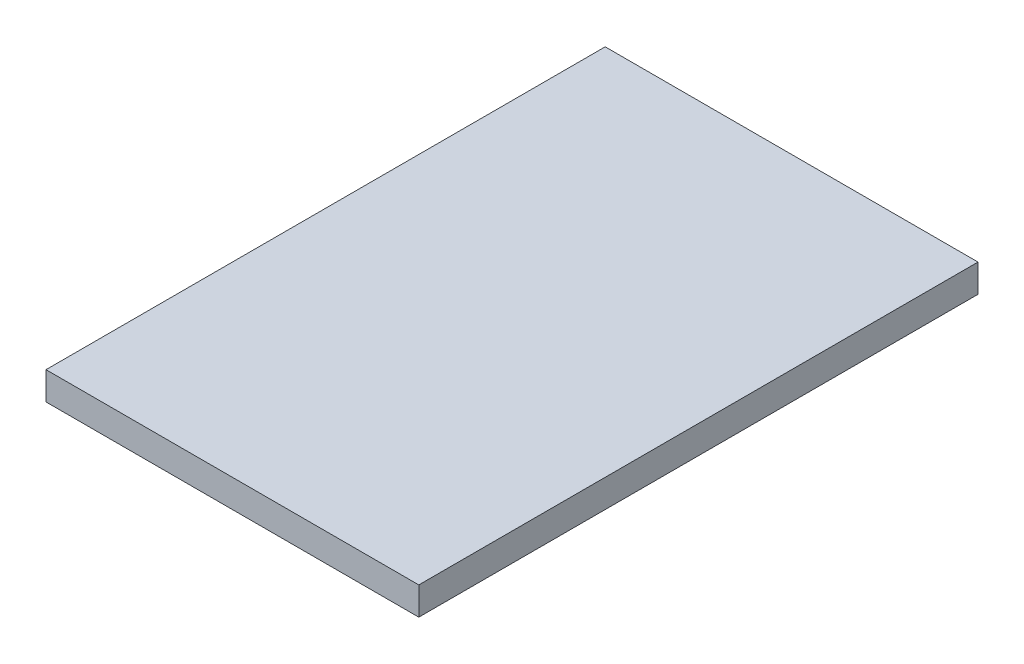
ISO-10303-21;
HEADER;
FILE_DESCRIPTION(('STEP AP214'),'2;1');
FILE_NAME('part.step','',(''),(''),'','','');
FILE_SCHEMA(('AUTOMOTIVE_DESIGN { 1 0 10303 214 1 1 1 1 }'));
ENDSEC;
DATA;
#1=APPLICATION_CONTEXT('core data for automotive mechanical design processes');
#2=APPLICATION_PROTOCOL_DEFINITION('international standard','automotive_design',2000,#1);
#3=PRODUCT_CONTEXT('',#1,'mechanical');
#4=PRODUCT('Part','Part','',(#3));
#5=PRODUCT_RELATED_PRODUCT_CATEGORY('part','',(#4));
#6=PRODUCT_DEFINITION_FORMATION('','',#4);
#7=PRODUCT_DEFINITION_CONTEXT('part definition',#1,'design');
#8=PRODUCT_DEFINITION('design','',#6,#7);
#9=PRODUCT_DEFINITION_SHAPE('','',#8);
#10=(LENGTH_UNIT() NAMED_UNIT(*) SI_UNIT(.MILLI.,.METRE.));
#11=(NAMED_UNIT(*) PLANE_ANGLE_UNIT() SI_UNIT($,.RADIAN.));
#12=(NAMED_UNIT(*) SI_UNIT($,.STERADIAN.) SOLID_ANGLE_UNIT());
#13=UNCERTAINTY_MEASURE_WITH_UNIT(LENGTH_MEASURE(1.E-05),#10,'distance_accuracy_value','');
#14=(GEOMETRIC_REPRESENTATION_CONTEXT(3) GLOBAL_UNCERTAINTY_ASSIGNED_CONTEXT((#13)) GLOBAL_UNIT_ASSIGNED_CONTEXT((#10,
#11,#12)) REPRESENTATION_CONTEXT('',''));
#15=CARTESIAN_POINT('',(0.,0.,0.));
#16=DIRECTION('',(0.,0.,1.));
#17=DIRECTION('',(1.,0.,0.));
#18=AXIS2_PLACEMENT_3D('',#15,#16,#17);
#19=CARTESIAN_POINT('',(0.,19.05,0.));
#20=DIRECTION('',(1.,0.,0.));
#21=DIRECTION('',(0.,0.,-1.));
#22=AXIS2_PLACEMENT_3D('',#19,#20,#21);
#23=PLANE('',#22);
#24=DIRECTION('',(0.,0.,1.));
#25=VECTOR('',#24,1.);
#26=CARTESIAN_POINT('',(0.,0.,0.));
#27=LINE('',#26,#25);
#28=CARTESIAN_POINT('',(0.,0.,-381.));
#29=VERTEX_POINT('',#28);
#30=CARTESIAN_POINT('',(0.,0.,0.));
#31=VERTEX_POINT('',#30);
#32=EDGE_CURVE('E97',#29,#31,#27,.T.);
#33=ORIENTED_EDGE('',*,*,#32,.T.);
#34=DIRECTION('',(0.,-1.,0.));
#35=VECTOR('',#34,1.);
#36=CARTESIAN_POINT('',(0.,19.05,0.));
#37=LINE('',#36,#35);
#38=CARTESIAN_POINT('',(0.,19.05,0.));
#39=VERTEX_POINT('',#38);
#40=EDGE_CURVE('E11',#39,#31,#37,.T.);
#41=ORIENTED_EDGE('',*,*,#40,.F.);
#42=DIRECTION('',(0.,0.,1.));
#43=VECTOR('',#42,1.);
#44=CARTESIAN_POINT('',(0.,19.05,0.));
#45=LINE('',#44,#43);
#46=CARTESIAN_POINT('',(0.,19.05,-381.));
#47=VERTEX_POINT('',#46);
#48=EDGE_CURVE('E85',#47,#39,#45,.T.);
#49=ORIENTED_EDGE('',*,*,#48,.F.);
#50=DIRECTION('',(0.,-1.,0.));
#51=VECTOR('',#50,1.);
#52=CARTESIAN_POINT('',(0.,19.05,-381.));
#53=LINE('',#52,#51);
#54=EDGE_CURVE('E93',#47,#29,#53,.T.);
#55=ORIENTED_EDGE('',*,*,#54,.T.);
#56=EDGE_LOOP('',(#33,#41,#49,#55));
#57=FACE_BOUND('',#56,.T.);
#58=ADVANCED_FACE('F34',(#57),#23,.F.);
#59=CARTESIAN_POINT('',(0.,19.05,0.));
#60=DIRECTION('',(0.,0.,-1.));
#61=DIRECTION('',(-1.,0.,0.));
#62=AXIS2_PLACEMENT_3D('',#59,#60,#61);
#63=PLANE('',#62);
#64=DIRECTION('',(1.,0.,0.));
#65=VECTOR('',#64,1.);
#66=CARTESIAN_POINT('',(0.,0.,0.));
#67=LINE('',#66,#65);
#68=CARTESIAN_POINT('',(254.,0.,0.));
#69=VERTEX_POINT('',#68);
#70=EDGE_CURVE('E89',#31,#69,#67,.T.);
#71=ORIENTED_EDGE('',*,*,#70,.T.);
#72=DIRECTION('',(0.,-1.,0.));
#73=VECTOR('',#72,1.);
#74=CARTESIAN_POINT('',(254.,19.05,0.));
#75=LINE('',#74,#73);
#76=CARTESIAN_POINT('',(254.,19.05,0.));
#77=VERTEX_POINT('',#76);
#78=EDGE_CURVE('E42',#77,#69,#75,.T.);
#79=ORIENTED_EDGE('',*,*,#78,.F.);
#80=DIRECTION('',(1.,0.,0.));
#81=VECTOR('',#80,1.);
#82=CARTESIAN_POINT('',(0.,19.05,0.));
#83=LINE('',#82,#81);
#84=EDGE_CURVE('E80',#39,#77,#83,.T.);
#85=ORIENTED_EDGE('',*,*,#84,.F.);
#86=ORIENTED_EDGE('',*,*,#40,.T.);
#87=EDGE_LOOP('',(#71,#79,#85,#86));
#88=FACE_BOUND('',#87,.T.);
#89=ADVANCED_FACE('F88',(#88),#63,.F.);
#90=CARTESIAN_POINT('',(254.,19.05,0.));
#91=DIRECTION('',(-1.,0.,0.));
#92=DIRECTION('',(0.,0.,1.));
#93=AXIS2_PLACEMENT_3D('',#90,#91,#92);
#94=PLANE('',#93);
#95=DIRECTION('',(0.,0.,-1.));
#96=VECTOR('',#95,1.);
#97=CARTESIAN_POINT('',(254.,0.,0.));
#98=LINE('',#97,#96);
#99=CARTESIAN_POINT('',(254.,0.,-381.));
#100=VERTEX_POINT('',#99);
#101=EDGE_CURVE('E67',#69,#100,#98,.T.);
#102=ORIENTED_EDGE('',*,*,#101,.T.);
#103=DIRECTION('',(0.,-1.,0.));
#104=VECTOR('',#103,1.);
#105=CARTESIAN_POINT('',(254.,19.05,-381.));
#106=LINE('',#105,#104);
#107=CARTESIAN_POINT('',(254.,19.05,-381.));
#108=VERTEX_POINT('',#107);
#109=EDGE_CURVE('E90',#108,#100,#106,.T.);
#110=ORIENTED_EDGE('',*,*,#109,.F.);
#111=DIRECTION('',(0.,0.,-1.));
#112=VECTOR('',#111,1.);
#113=CARTESIAN_POINT('',(254.,19.05,0.));
#114=LINE('',#113,#112);
#115=EDGE_CURVE('E83',#77,#108,#114,.T.);
#116=ORIENTED_EDGE('',*,*,#115,.F.);
#117=ORIENTED_EDGE('',*,*,#78,.T.);
#118=EDGE_LOOP('',(#102,#110,#116,#117));
#119=FACE_BOUND('',#118,.T.);
#120=ADVANCED_FACE('F91',(#119),#94,.F.);
#121=CARTESIAN_POINT('',(0.,19.05,-381.));
#122=DIRECTION('',(0.,0.,1.));
#123=DIRECTION('',(1.,0.,0.));
#124=AXIS2_PLACEMENT_3D('',#121,#122,#123);
#125=PLANE('',#124);
#126=DIRECTION('',(-1.,0.,0.));
#127=VECTOR('',#126,1.);
#128=CARTESIAN_POINT('',(0.,0.,-381.));
#129=LINE('',#128,#127);
#130=EDGE_CURVE('E73',#100,#29,#129,.T.);
#131=ORIENTED_EDGE('',*,*,#130,.T.);
#132=ORIENTED_EDGE('',*,*,#54,.F.);
#133=DIRECTION('',(-1.,0.,0.));
#134=VECTOR('',#133,1.);
#135=CARTESIAN_POINT('',(0.,19.05,-381.));
#136=LINE('',#135,#134);
#137=EDGE_CURVE('E50',#108,#47,#136,.T.);
#138=ORIENTED_EDGE('',*,*,#137,.F.);
#139=ORIENTED_EDGE('',*,*,#109,.T.);
#140=EDGE_LOOP('',(#131,#132,#138,#139));
#141=FACE_BOUND('',#140,.T.);
#142=ADVANCED_FACE('F104',(#141),#125,.F.);
#143=CARTESIAN_POINT('',(0.,19.05,0.));
#144=DIRECTION('',(0.,-1.,0.));
#145=DIRECTION('',(0.,0.,-1.));
#146=AXIS2_PLACEMENT_3D('',#143,#144,#145);
#147=PLANE('',#146);
#148=ORIENTED_EDGE('',*,*,#48,.T.);
#149=ORIENTED_EDGE('',*,*,#84,.T.);
#150=ORIENTED_EDGE('',*,*,#115,.T.);
#151=ORIENTED_EDGE('',*,*,#137,.T.);
#152=EDGE_LOOP('',(#148,#149,#150,#151));
#153=FACE_BOUND('',#152,.T.);
#154=ADVANCED_FACE('F81',(#153),#147,.F.);
#155=CARTESIAN_POINT('',(0.,0.,0.));
#156=DIRECTION('',(0.,-1.,0.));
#157=DIRECTION('',(0.,0.,-1.));
#158=AXIS2_PLACEMENT_3D('',#155,#156,#157);
#159=PLANE('',#158);
#160=ORIENTED_EDGE('',*,*,#32,.F.);
#161=ORIENTED_EDGE('',*,*,#130,.F.);
#162=ORIENTED_EDGE('',*,*,#101,.F.);
#163=ORIENTED_EDGE('',*,*,#70,.F.);
#164=EDGE_LOOP('',(#160,#161,#162,#163));
#165=FACE_BOUND('',#164,.T.);
#166=ADVANCED_FACE('F107',(#165),#159,.T.);
#167=CLOSED_SHELL('',(#58,#89,#120,#142,#154,#166));
#168=MANIFOLD_SOLID_BREP('B2',#167);
#169=ADVANCED_BREP_SHAPE_REPRESENTATION('',(#18,#168),#14);
#170=SHAPE_DEFINITION_REPRESENTATION(#9,#169);
ENDSEC;
END-ISO-10303-21;
